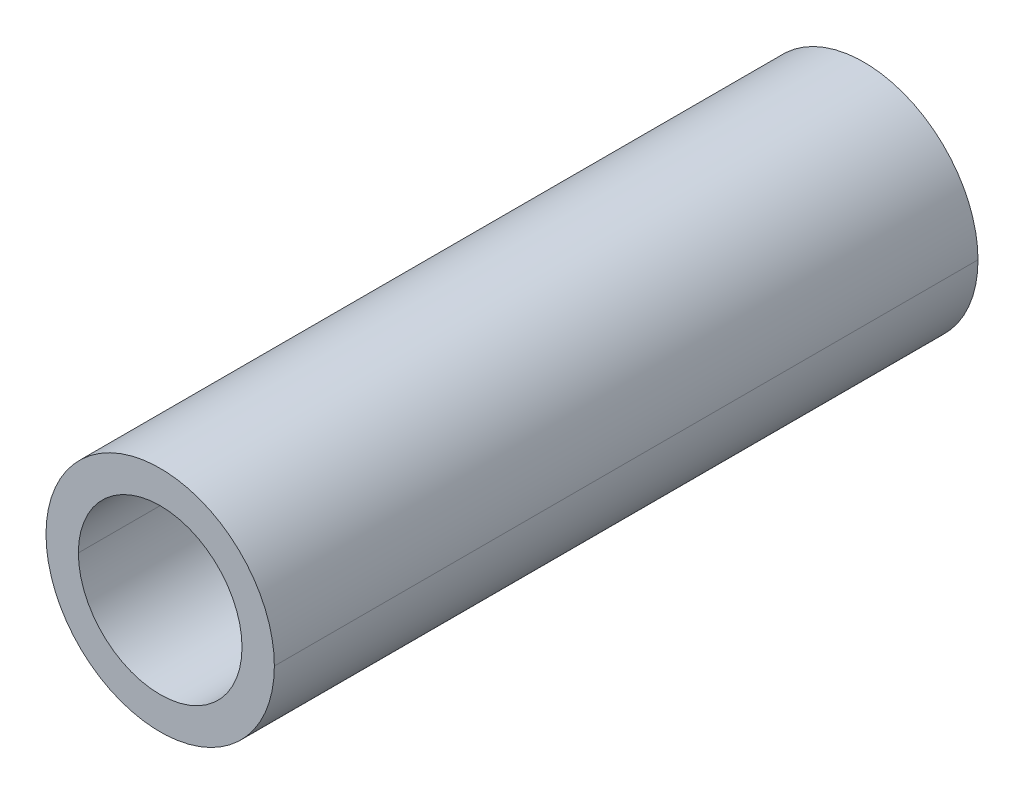
ISO-10303-21;
HEADER;
FILE_DESCRIPTION(('STEP AP214'),'2;1');
FILE_NAME('part.step','',(''),(''),'','','');
FILE_SCHEMA(('AUTOMOTIVE_DESIGN { 1 0 10303 214 1 1 1 1 }'));
ENDSEC;
DATA;
#1=APPLICATION_CONTEXT('core data for automotive mechanical design processes');
#2=APPLICATION_PROTOCOL_DEFINITION('international standard','automotive_design',2000,#1);
#3=PRODUCT_CONTEXT('',#1,'mechanical');
#4=PRODUCT('Part','Part','',(#3));
#5=PRODUCT_RELATED_PRODUCT_CATEGORY('part','',(#4));
#6=PRODUCT_DEFINITION_FORMATION('','',#4);
#7=PRODUCT_DEFINITION_CONTEXT('part definition',#1,'design');
#8=PRODUCT_DEFINITION('design','',#6,#7);
#9=PRODUCT_DEFINITION_SHAPE('','',#8);
#10=(LENGTH_UNIT() NAMED_UNIT(*) SI_UNIT(.MILLI.,.METRE.));
#11=(NAMED_UNIT(*) PLANE_ANGLE_UNIT() SI_UNIT($,.RADIAN.));
#12=(NAMED_UNIT(*) SI_UNIT($,.STERADIAN.) SOLID_ANGLE_UNIT());
#13=UNCERTAINTY_MEASURE_WITH_UNIT(LENGTH_MEASURE(1.E-05),#10,'distance_accuracy_value','');
#14=(GEOMETRIC_REPRESENTATION_CONTEXT(3) GLOBAL_UNCERTAINTY_ASSIGNED_CONTEXT((#13)) GLOBAL_UNIT_ASSIGNED_CONTEXT((#10,
#11,#12)) REPRESENTATION_CONTEXT('',''));
#15=CARTESIAN_POINT('',(0.,0.,0.));
#16=DIRECTION('',(0.,0.,1.));
#17=DIRECTION('',(1.,0.,0.));
#18=AXIS2_PLACEMENT_3D('',#15,#16,#17);
#19=CARTESIAN_POINT('',(0.,0.,18.4875));
#20=DIRECTION('',(0.,0.,-1.));
#21=DIRECTION('',(-1.,0.,0.));
#22=AXIS2_PLACEMENT_3D('',#19,#20,#21);
#23=CYLINDRICAL_SURFACE('',#22,2.15);
#24=CARTESIAN_POINT('',(0.,0.,18.4875));
#25=DIRECTION('',(0.,0.,1.));
#26=DIRECTION('',(1.,0.,0.));
#27=AXIS2_PLACEMENT_3D('',#24,#25,#26);
#28=CIRCLE('',#27,2.15);
#29=CARTESIAN_POINT('',(-2.15,0.,18.4875));
#30=VERTEX_POINT('',#29);
#31=CARTESIAN_POINT('',(2.15,0.,18.4875));
#32=VERTEX_POINT('',#31);
#33=EDGE_CURVE('E11',#30,#32,#28,.T.);
#34=ORIENTED_EDGE('',*,*,#33,.T.);
#35=DIRECTION('',(0.,0.,-1.));
#36=VECTOR('',#35,1.);
#37=CARTESIAN_POINT('',(2.15,0.,18.4875));
#38=LINE('',#37,#36);
#39=CARTESIAN_POINT('',(2.15,0.,0.));
#40=VERTEX_POINT('',#39);
#41=EDGE_CURVE('E27',#32,#40,#38,.T.);
#42=ORIENTED_EDGE('',*,*,#41,.T.);
#43=CARTESIAN_POINT('',(0.,0.,0.));
#44=DIRECTION('',(0.,0.,1.));
#45=DIRECTION('',(1.,0.,0.));
#46=AXIS2_PLACEMENT_3D('',#43,#44,#45);
#47=CIRCLE('',#46,2.15);
#48=CARTESIAN_POINT('',(-2.15,0.,0.));
#49=VERTEX_POINT('',#48);
#50=EDGE_CURVE('E71',#49,#40,#47,.T.);
#51=ORIENTED_EDGE('',*,*,#50,.F.);
#52=DIRECTION('',(0.,0.,-1.));
#53=VECTOR('',#52,1.);
#54=CARTESIAN_POINT('',(-2.15,0.,18.4875));
#55=LINE('',#54,#53);
#56=EDGE_CURVE('E68',#30,#49,#55,.T.);
#57=ORIENTED_EDGE('',*,*,#56,.F.);
#58=EDGE_LOOP('',(#34,#42,#51,#57));
#59=FACE_BOUND('',#58,.T.);
#60=ADVANCED_FACE('F17',(#59),#23,.F.);
#61=CARTESIAN_POINT('',(0.,0.,18.4875));
#62=DIRECTION('',(0.,0.,-1.));
#63=DIRECTION('',(-1.,0.,0.));
#64=AXIS2_PLACEMENT_3D('',#61,#62,#63);
#65=CYLINDRICAL_SURFACE('',#64,3.);
#66=CARTESIAN_POINT('',(0.,0.,18.4875));
#67=DIRECTION('',(0.,0.,1.));
#68=DIRECTION('',(1.,0.,0.));
#69=AXIS2_PLACEMENT_3D('',#66,#67,#68);
#70=CIRCLE('',#69,3.);
#71=CARTESIAN_POINT('',(3.,0.,18.4875));
#72=VERTEX_POINT('',#71);
#73=CARTESIAN_POINT('',(-3.,0.,18.4875));
#74=VERTEX_POINT('',#73);
#75=EDGE_CURVE('E97',#72,#74,#70,.T.);
#76=ORIENTED_EDGE('',*,*,#75,.F.);
#77=DIRECTION('',(0.,0.,-1.));
#78=VECTOR('',#77,1.);
#79=CARTESIAN_POINT('',(3.,0.,18.4875));
#80=LINE('',#79,#78);
#81=CARTESIAN_POINT('',(3.,0.,0.));
#82=VERTEX_POINT('',#81);
#83=EDGE_CURVE('E92',#72,#82,#80,.T.);
#84=ORIENTED_EDGE('',*,*,#83,.T.);
#85=CARTESIAN_POINT('',(0.,0.,0.));
#86=DIRECTION('',(0.,0.,1.));
#87=DIRECTION('',(1.,0.,0.));
#88=AXIS2_PLACEMENT_3D('',#85,#86,#87);
#89=CIRCLE('',#88,3.);
#90=CARTESIAN_POINT('',(-3.,0.,0.));
#91=VERTEX_POINT('',#90);
#92=EDGE_CURVE('E96',#82,#91,#89,.T.);
#93=ORIENTED_EDGE('',*,*,#92,.T.);
#94=DIRECTION('',(0.,0.,-1.));
#95=VECTOR('',#94,1.);
#96=CARTESIAN_POINT('',(-3.,0.,18.4875));
#97=LINE('',#96,#95);
#98=EDGE_CURVE('E20',#74,#91,#97,.T.);
#99=ORIENTED_EDGE('',*,*,#98,.F.);
#100=EDGE_LOOP('',(#76,#84,#93,#99));
#101=FACE_BOUND('',#100,.T.);
#102=ADVANCED_FACE('F117',(#101),#65,.T.);
#103=CARTESIAN_POINT('',(0.,0.,18.4875));
#104=DIRECTION('',(0.,0.,1.));
#105=DIRECTION('',(1.,0.,0.));
#106=AXIS2_PLACEMENT_3D('',#103,#104,#105);
#107=PLANE('',#106);
#108=CARTESIAN_POINT('',(0.,0.,18.4875));
#109=DIRECTION('',(0.,0.,1.));
#110=DIRECTION('',(1.,0.,0.));
#111=AXIS2_PLACEMENT_3D('',#108,#109,#110);
#112=CIRCLE('',#111,3.);
#113=EDGE_CURVE('E100',#74,#72,#112,.T.);
#114=ORIENTED_EDGE('',*,*,#113,.T.);
#115=ORIENTED_EDGE('',*,*,#75,.T.);
#116=EDGE_LOOP('',(#114,#115));
#117=FACE_BOUND('',#116,.T.);
#118=ORIENTED_EDGE('',*,*,#33,.F.);
#119=CARTESIAN_POINT('',(0.,0.,18.4875));
#120=DIRECTION('',(0.,0.,1.));
#121=DIRECTION('',(1.,0.,0.));
#122=AXIS2_PLACEMENT_3D('',#119,#120,#121);
#123=CIRCLE('',#122,2.15);
#124=EDGE_CURVE('E74',#32,#30,#123,.T.);
#125=ORIENTED_EDGE('',*,*,#124,.F.);
#126=EDGE_LOOP('',(#118,#125));
#127=FACE_BOUND('',#126,.T.);
#128=ADVANCED_FACE('F77',(#117,#127),#107,.T.);
#129=CARTESIAN_POINT('',(0.,0.,0.));
#130=DIRECTION('',(0.,0.,1.));
#131=DIRECTION('',(1.,0.,0.));
#132=AXIS2_PLACEMENT_3D('',#129,#130,#131);
#133=PLANE('',#132);
#134=CARTESIAN_POINT('',(0.,0.,0.));
#135=DIRECTION('',(0.,0.,1.));
#136=DIRECTION('',(1.,0.,0.));
#137=AXIS2_PLACEMENT_3D('',#134,#135,#136);
#138=CIRCLE('',#137,3.);
#139=EDGE_CURVE('E80',#91,#82,#138,.T.);
#140=ORIENTED_EDGE('',*,*,#139,.F.);
#141=ORIENTED_EDGE('',*,*,#92,.F.);
#142=EDGE_LOOP('',(#140,#141));
#143=FACE_BOUND('',#142,.T.);
#144=ORIENTED_EDGE('',*,*,#50,.T.);
#145=CARTESIAN_POINT('',(0.,0.,0.));
#146=DIRECTION('',(0.,0.,1.));
#147=DIRECTION('',(1.,0.,0.));
#148=AXIS2_PLACEMENT_3D('',#145,#146,#147);
#149=CIRCLE('',#148,2.15);
#150=EDGE_CURVE('E89',#40,#49,#149,.T.);
#151=ORIENTED_EDGE('',*,*,#150,.T.);
#152=EDGE_LOOP('',(#144,#151));
#153=FACE_BOUND('',#152,.T.);
#154=ADVANCED_FACE('F121',(#143,#153),#133,.F.);
#155=CARTESIAN_POINT('',(0.,0.,18.4875));
#156=DIRECTION('',(0.,0.,-1.));
#157=DIRECTION('',(-1.,0.,0.));
#158=AXIS2_PLACEMENT_3D('',#155,#156,#157);
#159=CYLINDRICAL_SURFACE('',#158,3.);
#160=ORIENTED_EDGE('',*,*,#83,.F.);
#161=ORIENTED_EDGE('',*,*,#113,.F.);
#162=ORIENTED_EDGE('',*,*,#98,.T.);
#163=ORIENTED_EDGE('',*,*,#139,.T.);
#164=EDGE_LOOP('',(#160,#161,#162,#163));
#165=FACE_BOUND('',#164,.T.);
#166=ADVANCED_FACE('F124',(#165),#159,.T.);
#167=CARTESIAN_POINT('',(0.,0.,18.4875));
#168=DIRECTION('',(0.,0.,-1.));
#169=DIRECTION('',(-1.,0.,0.));
#170=AXIS2_PLACEMENT_3D('',#167,#168,#169);
#171=CYLINDRICAL_SURFACE('',#170,2.15);
#172=ORIENTED_EDGE('',*,*,#41,.F.);
#173=ORIENTED_EDGE('',*,*,#124,.T.);
#174=ORIENTED_EDGE('',*,*,#56,.T.);
#175=ORIENTED_EDGE('',*,*,#150,.F.);
#176=EDGE_LOOP('',(#172,#173,#174,#175));
#177=FACE_BOUND('',#176,.T.);
#178=ADVANCED_FACE('F78',(#177),#171,.F.);
#179=CLOSED_SHELL('',(#60,#102,#128,#154,#166,#178));
#180=MANIFOLD_SOLID_BREP('B1',#179);
#181=ADVANCED_BREP_SHAPE_REPRESENTATION('',(#18,#180),#14);
#182=SHAPE_DEFINITION_REPRESENTATION(#9,#181);
ENDSEC;
END-ISO-10303-21;
